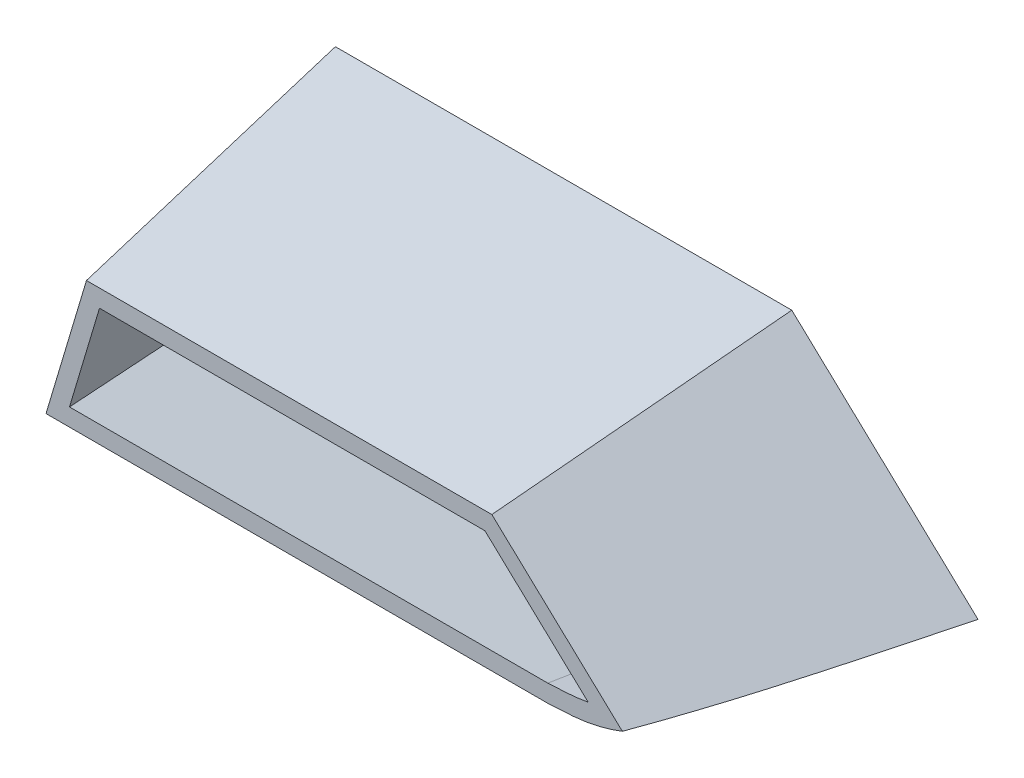
ISO-10303-21;
HEADER;
FILE_DESCRIPTION(('STEP AP214'),'2;1');
FILE_NAME('part.step','',(''),(''),'','','');
FILE_SCHEMA(('AUTOMOTIVE_DESIGN { 1 0 10303 214 1 1 1 1 }'));
ENDSEC;
DATA;
#1=APPLICATION_CONTEXT('core data for automotive mechanical design processes');
#2=APPLICATION_PROTOCOL_DEFINITION('international standard','automotive_design',2000,#1);
#3=PRODUCT_CONTEXT('',#1,'mechanical');
#4=PRODUCT('Part','Part','',(#3));
#5=PRODUCT_RELATED_PRODUCT_CATEGORY('part','',(#4));
#6=PRODUCT_DEFINITION_FORMATION('','',#4);
#7=PRODUCT_DEFINITION_CONTEXT('part definition',#1,'design');
#8=PRODUCT_DEFINITION('design','',#6,#7);
#9=PRODUCT_DEFINITION_SHAPE('','',#8);
#10=(LENGTH_UNIT() NAMED_UNIT(*) SI_UNIT(.MILLI.,.METRE.));
#11=(NAMED_UNIT(*) PLANE_ANGLE_UNIT() SI_UNIT($,.RADIAN.));
#12=(NAMED_UNIT(*) SI_UNIT($,.STERADIAN.) SOLID_ANGLE_UNIT());
#13=UNCERTAINTY_MEASURE_WITH_UNIT(LENGTH_MEASURE(1.E-05),#10,'distance_accuracy_value','');
#14=(GEOMETRIC_REPRESENTATION_CONTEXT(3) GLOBAL_UNCERTAINTY_ASSIGNED_CONTEXT((#13)) GLOBAL_UNIT_ASSIGNED_CONTEXT((#10,
#11,#12)) REPRESENTATION_CONTEXT('',''));
#15=CARTESIAN_POINT('',(0.,0.,0.));
#16=DIRECTION('',(0.,0.,1.));
#17=DIRECTION('',(1.,0.,0.));
#18=AXIS2_PLACEMENT_3D('',#15,#16,#17);
#19=CARTESIAN_POINT('',(14.7936218819312,-5.19866844095488,14.6));
#20=DIRECTION('',(0.,0.,1.));
#21=DIRECTION('',(1.,0.,0.));
#22=AXIS2_PLACEMENT_3D('',#19,#20,#21);
#23=PLANE('',#22);
#24=DIRECTION('',(1.,0.,0.));
#25=VECTOR('',#24,1.);
#26=CARTESIAN_POINT('',(-15.9304061955981,-2.59983174647262,14.6));
#27=LINE('',#26,#25);
#28=CARTESIAN_POINT('',(-14.0583460898602,-2.59983174647262,14.6));
#29=VERTEX_POINT('',#28);
#30=CARTESIAN_POINT('',(10.684004482191,-2.59983174647261,14.6));
#31=VERTEX_POINT('',#30);
#32=EDGE_CURVE('E436',#29,#31,#27,.T.);
#33=ORIENTED_EDGE('',*,*,#32,.F.);
#34=DIRECTION('',(-0.286097759922416,-0.958200434025875,0.));
#35=VECTOR('',#34,1.);
#36=CARTESIAN_POINT('',(-12.0331924026506,4.18282584084831,14.6));
#37=LINE('',#36,#35);
#38=CARTESIAN_POINT('',(-12.5058399284595,2.59983174647262,14.6));
#39=VERTEX_POINT('',#38);
#40=EDGE_CURVE('E456',#39,#29,#37,.T.);
#41=ORIENTED_EDGE('',*,*,#40,.F.);
#42=DIRECTION('',(-1.,0.,0.));
#43=VECTOR('',#42,1.);
#44=CARTESIAN_POINT('',(8.30924752718058,2.59983174647261,14.6));
#45=LINE('',#44,#43);
#46=CARTESIAN_POINT('',(7.43198936747582,2.59983174647261,14.6));
#47=VERTEX_POINT('',#46);
#48=EDGE_CURVE('E467',#47,#39,#45,.T.);
#49=ORIENTED_EDGE('',*,*,#48,.F.);
#50=DIRECTION('',(-0.729323810427005,0.68416867769888,0.));
#51=VECTOR('',#50,1.);
#52=CARTESIAN_POINT('',(15.2546473535326,-4.73849657065382,14.6));
#53=LINE('',#52,#51);
#54=CARTESIAN_POINT('',(12.7716860804026,-2.40926460711722,14.6));
#55=VERTEX_POINT('',#54);
#56=EDGE_CURVE('E463',#55,#47,#53,.T.);
#57=ORIENTED_EDGE('',*,*,#56,.F.);
#58=CARTESIAN_POINT('',(10.684004482191,-2.59983174647261,14.6));
#59=CARTESIAN_POINT('',(10.7714044682376,-2.59588328886062,14.6));
#60=CARTESIAN_POINT('',(10.8588056438328,-2.59193488725516,14.6));
#61=CARTESIAN_POINT('',(11.0335344538954,-2.58370416022969,14.6));
#62=CARTESIAN_POINT('',(11.1208620989292,-2.57942205609473,14.6));
#63=CARTESIAN_POINT('',(11.295426720252,-2.5701885531721,14.6));
#64=CARTESIAN_POINT('',(11.3826637187209,-2.5652375869616,14.6));
#65=CARTESIAN_POINT('',(11.5570267319296,-2.5542863804719,14.6));
#66=CARTESIAN_POINT('',(11.6441527810351,-2.54828670053682,14.6));
#67=CARTESIAN_POINT('',(11.8183567259758,-2.53483111086446,14.6));
#68=CARTESIAN_POINT('',(11.905434543931,-2.52737417215942,14.6));
#69=CARTESIAN_POINT('',(12.0794060434387,-2.51053228288508,14.6));
#70=CARTESIAN_POINT('',(12.1662997291294,-2.50114737611906,14.6));
#71=CARTESIAN_POINT('',(12.3398203779396,-2.47976959008637,14.6));
#72=CARTESIAN_POINT('',(12.426447170661,-2.46777529783742,14.6));
#73=CARTESIAN_POINT('',(12.599379843234,-2.4408260426048,14.6));
#74=CARTESIAN_POINT('',(12.6856849818115,-2.42586634374298,14.6));
#75=CARTESIAN_POINT('',(12.7716860804026,-2.40926460711722,14.6));
#76=B_SPLINE_CURVE_WITH_KNOTS('',3,(#58,#59,#60,#61,#62,#63,#64,#65,#66,#67,#68,#69,#70,#71,#72,
#73,#74,#75),.UNSPECIFIED.,.F.,.F.,(4,2,2,2,2,2,2,2,4),(0.,0.262469383072965,0.52476617454889,
0.786894134166097,1.0488824604843,1.31105644907393,1.57322448175061,1.83553483335355,
2.09826753053661),.UNSPECIFIED.);
#77=EDGE_CURVE('E460',#31,#55,#76,.T.);
#78=ORIENTED_EDGE('',*,*,#77,.F.);
#79=EDGE_LOOP('',(#33,#41,#49,#57,#78));
#80=FACE_BOUND('',#79,.T.);
#81=DIRECTION('',(1.,0.,0.));
#82=VECTOR('',#81,1.);
#83=CARTESIAN_POINT('',(14.7936218819312,3.50480108227789,14.6));
#84=LINE('',#83,#82);
#85=CARTESIAN_POINT('',(7.79002044881684,3.50480108227789,14.6));
#86=VERTEX_POINT('',#85);
#87=CARTESIAN_POINT('',(-13.1800826162012,3.50480108227789,14.6));
#88=VERTEX_POINT('',#87);
#89=EDGE_CURVE('E320',#86,#88,#84,.F.);
#90=ORIENTED_EDGE('',*,*,#89,.T.);
#91=DIRECTION('',(0.286097759922416,0.958200434025875,0.));
#92=VECTOR('',#91,1.);
#93=CARTESIAN_POINT('',(-13.276341375105,3.18241063579048,14.6));
#94=LINE('',#93,#92);
#95=CARTESIAN_POINT('',(-15.2729970065662,-3.5048010822779,14.6));
#96=VERTEX_POINT('',#95);
#97=EDGE_CURVE('E12',#88,#96,#94,.F.);
#98=ORIENTED_EDGE('',*,*,#97,.T.);
#99=DIRECTION('',(-1.,0.,0.));
#100=VECTOR('',#99,1.);
#101=CARTESIAN_POINT('',(14.7936218819312,-3.50480108227789,14.6));
#102=LINE('',#101,#100);
#103=CARTESIAN_POINT('',(10.7043290764765,-3.50480108227789,14.6));
#104=VERTEX_POINT('',#103);
#105=EDGE_CURVE('E214',#96,#104,#102,.F.);
#106=ORIENTED_EDGE('',*,*,#105,.T.);
#107=CARTESIAN_POINT('',(10.6524149917925,-3.50713874079241,14.6));
#108=CARTESIAN_POINT('',(10.772277045654,-3.50170925551978,14.6));
#109=CARTESIAN_POINT('',(10.8921458689353,-3.49633428803626,14.6));
#110=CARTESIAN_POINT('',(11.1321015272363,-3.48489312213885,14.6));
#111=CARTESIAN_POINT('',(11.2521882927576,-3.47882549889116,14.6));
#112=CARTESIAN_POINT('',(11.4923755007352,-3.46520956486976,14.6));
#113=CARTESIAN_POINT('',(11.612475880399,-3.45766009946973,14.6));
#114=CARTESIAN_POINT('',(11.8531336364871,-3.4400980031663,14.6));
#115=CARTESIAN_POINT('',(11.973690142518,-3.43007277016102,14.6));
#116=CARTESIAN_POINT('',(12.154225360788,-3.41241590825715,14.6));
#117=CARTESIAN_POINT('',(12.2143323374642,-3.40609652126912,14.6));
#118=CARTESIAN_POINT('',(12.3344310160354,-3.39244387218179,14.6));
#119=CARTESIAN_POINT('',(12.3944227200504,-3.38511062891366,14.6));
#120=CARTESIAN_POINT('',(12.5142187158919,-3.36924116668151,14.6));
#121=CARTESIAN_POINT('',(12.5740230842826,-3.36070553083567,14.6));
#122=CARTESIAN_POINT('',(12.6934284040449,-3.34230794545135,14.6));
#123=CARTESIAN_POINT('',(12.7530293510446,-3.33244596758969,14.6));
#124=CARTESIAN_POINT('',(12.8932911568202,-3.30769479525054,14.6));
#125=CARTESIAN_POINT('',(12.9738580779211,-3.29226930835966,14.6));
#126=CARTESIAN_POINT('',(13.1345136960284,-3.25910931364986,14.6));
#127=CARTESIAN_POINT('',(13.214602377847,-3.24137473290294,14.6));
#128=CARTESIAN_POINT('',(13.4542466415532,-3.18476461184645,14.6));
#129=CARTESIAN_POINT('',(13.6130221520276,-3.14251080671862,14.6));
#130=CARTESIAN_POINT('',(13.8493289918649,-3.07268262547496,14.6));
#131=CARTESIAN_POINT('',(13.9278294433236,-3.04831743263716,14.6));
#132=CARTESIAN_POINT('',(14.0841659147625,-2.99753555830933,14.6));
#133=CARTESIAN_POINT('',(14.1620019253518,-2.9711188478776,14.6));
#134=CARTESIAN_POINT('',(14.394036605793,-2.88887732870711,14.6));
#135=CARTESIAN_POINT('',(14.5471497774846,-2.82994665603595,14.6));
#136=CARTESIAN_POINT('',(14.8494334065726,-2.70305994031673,14.6));
#137=CARTESIAN_POINT('',(14.9986079039164,-2.63511361313214,14.6));
#138=CARTESIAN_POINT('',(15.2185297675916,-2.52573431927287,14.6));
#139=CARTESIAN_POINT('',(15.2911547572951,-2.48805603049151,14.6));
#140=CARTESIAN_POINT('',(15.3990385327609,-2.42960174849371,14.6));
#141=CARTESIAN_POINT('',(15.4348232782175,-2.40979470697124,14.6));
#142=CARTESIAN_POINT('',(15.5060057071773,-2.36949694606007,14.6));
#143=CARTESIAN_POINT('',(15.5414033915777,-2.34900622825642,14.6));
#144=CARTESIAN_POINT('',(15.6566138683972,-2.28088191443597,14.6));
#145=CARTESIAN_POINT('',(15.7356249777476,-2.23188981630183,14.6));
#146=CARTESIAN_POINT('',(15.8920808016518,-2.13138288903183,14.6));
#147=CARTESIAN_POINT('',(15.9695244833564,-2.07986646837561,14.6));
#148=CARTESIAN_POINT('',(16.1232101831306,-1.97497120860202,14.6));
#149=CARTESIAN_POINT('',(16.1994513738978,-1.92159116208243,14.6));
#150=CARTESIAN_POINT('',(16.3511352161696,-1.81344210567241,14.6));
#151=CARTESIAN_POINT('',(16.4265762693957,-1.75867086554931,14.6));
#152=CARTESIAN_POINT('',(16.5768348028442,-1.64840435113619,14.6));
#153=CARTESIAN_POINT('',(16.6516527206602,-1.59290967028914,14.6));
#154=CARTESIAN_POINT('',(16.8008481739743,-1.48162781561766,14.6));
#155=CARTESIAN_POINT('',(16.8752262786624,-1.42584140619133,14.6));
#156=CARTESIAN_POINT('',(16.949589159885,-1.37003825472121,14.6));
#157=B_SPLINE_CURVE_WITH_KNOTS('',3,(#107,#108,#109,#110,#111,#112,#113,#114,#115,#116,#117,
#118,#119,#120,#121,#122,#123,#124,#125,#126,#127,#128,#129,#130,#131,#132,#133,#134,#135,#136,
#137,#138,#139,#140,#141,#142,#143,#144,#145,#146,#147,#148,#149,#150,#151,#152,#153,#154,#155,
#156),.UNSPECIFIED.,.F.,.F.,(4,2,2,2,2,2,2,2,2,2,2,2,2,2,2,2,2,2,2,2,2,2,2,2,4),(0.,
0.35996237248499,0.72067902540766,1.08167786643008,1.44455356517412,1.62586139556981,
1.80716585884167,1.98838269659848,2.1696034047403,2.41565657840056,2.6617175250326,
3.15432105844578,3.40088302730469,3.64744847515816,4.13936772785254,4.63076109742553,
4.87616422323666,4.99885955825825,5.12155460883993,5.400384447239,5.67939240120656,
5.95858460096019,6.23825681099338,6.51771247577042,6.79663256107343),.UNSPECIFIED.);
#158=CARTESIAN_POINT('',(14.54283062352,-2.82991765571762,14.6000000000001));
#159=VERTEX_POINT('',#158);
#160=EDGE_CURVE('E370',#104,#159,#157,.T.);
#161=ORIENTED_EDGE('',*,*,#160,.T.);
#162=DIRECTION('',(0.729323810427005,-0.68416867769888,0.));
#163=VECTOR('',#162,1.);
#164=CARTESIAN_POINT('',(15.8581902772041,-4.0638385315939,14.6));
#165=LINE('',#164,#163);
#166=EDGE_CURVE('E367',#159,#86,#165,.F.);
#167=ORIENTED_EDGE('',*,*,#166,.T.);
#168=EDGE_LOOP('',(#90,#98,#106,#161,#167));
#169=FACE_BOUND('',#168,.T.);
#170=ADVANCED_FACE('F205',(#80,#169),#23,.T.);
#171=CARTESIAN_POINT('',(14.7844506684725,-5.20120377943338,0.));
#172=DIRECTION('',(0.,0.,1.));
#173=DIRECTION('',(1.,0.,0.));
#174=AXIS2_PLACEMENT_3D('',#171,#172,#173);
#175=PLANE('',#174);
#176=DIRECTION('',(-1.,0.,0.));
#177=VECTOR('',#176,1.);
#178=CARTESIAN_POINT('',(8.70487538679465,5.81721391101612,0.));
#179=LINE('',#178,#177);
#180=CARTESIAN_POINT('',(8.70487538679465,5.81721391101612,0.));
#181=VERTEX_POINT('',#180);
#182=CARTESIAN_POINT('',(-14.9029337440017,5.81721391101613,0.));
#183=VERTEX_POINT('',#182);
#184=EDGE_CURVE('E317',#181,#183,#179,.T.);
#185=ORIENTED_EDGE('',*,*,#184,.F.);
#186=DIRECTION('',(-0.729323810427005,0.68416867769888,0.));
#187=VECTOR('',#186,1.);
#188=CARTESIAN_POINT('',(18.3378563604631,-3.21935360649656,0.));
#189=LINE('',#188,#187);
#190=CARTESIAN_POINT('',(18.3378563604631,-3.21935360649656,0.));
#191=VERTEX_POINT('',#190);
#192=EDGE_CURVE('E328',#191,#181,#189,.T.);
#193=ORIENTED_EDGE('',*,*,#192,.F.);
#194=CARTESIAN_POINT('',(10.7563659342078,-5.81721391101612,0.));
#195=CARTESIAN_POINT('',(11.4399998810973,-5.78645110556188,0.));
#196=CARTESIAN_POINT('',(12.1236694648124,-5.75613160349603,0.));
#197=CARTESIAN_POINT('',(13.4810072981065,-5.57108125666555,0.));
#198=CARTESIAN_POINT('',(14.143159604675,-5.41365512562631,0.));
#199=CARTESIAN_POINT('',(15.1050962003712,-5.09497810633691,0.));
#200=CARTESIAN_POINT('',(15.4211702976325,-4.97510237980859,0.));
#201=CARTESIAN_POINT('',(16.0426625545695,-4.70353288078844,0.));
#202=CARTESIAN_POINT('',(16.3491061258154,-4.55123457448258,0.));
#203=CARTESIAN_POINT('',(17.2419644695506,-4.04008588116488,0.));
#204=CARTESIAN_POINT('',(17.7903481375785,-3.63036393372277,0.));
#205=CARTESIAN_POINT('',(18.3378563604631,-3.21935360649656,0.));
#206=B_SPLINE_CURVE_WITH_KNOTS('',3,(#194,#195,#196,#197,#198,#199,#200,#201,#202,#203,#204,
#205),.UNSPECIFIED.,.F.,.F.,(4,2,2,2,2,4),(0.,0.25,0.5,0.625,0.75,1.),.UNSPECIFIED.);
#207=CARTESIAN_POINT('',(10.7563659342078,-5.81721391101612,0.));
#208=VERTEX_POINT('',#207);
#209=EDGE_CURVE('E334',#208,#191,#206,.T.);
#210=ORIENTED_EDGE('',*,*,#209,.F.);
#211=DIRECTION('',(1.,0.,0.));
#212=VECTOR('',#211,1.);
#213=CARTESIAN_POINT('',(10.1422704682804,-5.81721391101613,0.));
#214=LINE('',#213,#212);
#215=CARTESIAN_POINT('',(-15.9577295317196,-5.81721391101613,0.));
#216=VERTEX_POINT('',#215);
#217=EDGE_CURVE('E354',#216,#208,#214,.T.);
#218=ORIENTED_EDGE('',*,*,#217,.F.);
#219=DIRECTION('',(0.99850798449248,-0.0546059054019312,0.));
#220=VECTOR('',#219,1.);
#221=CARTESIAN_POINT('',(-18.3378563604631,-5.68705072506922,0.));
#222=LINE('',#221,#220);
#223=CARTESIAN_POINT('',(-18.3378563604631,-5.68705072506922,0.));
#224=VERTEX_POINT('',#223);
#225=EDGE_CURVE('E345',#224,#216,#222,.T.);
#226=ORIENTED_EDGE('',*,*,#225,.F.);
#227=DIRECTION('',(-0.286097759922416,-0.958200434025875,0.));
#228=VECTOR('',#227,1.);
#229=CARTESIAN_POINT('',(-14.9029337440017,5.81721391101613,0.));
#230=LINE('',#229,#228);
#231=EDGE_CURVE('E339',#183,#224,#230,.T.);
#232=ORIENTED_EDGE('',*,*,#231,.F.);
#233=EDGE_LOOP('',(#185,#193,#210,#218,#226,#232));
#234=FACE_BOUND('',#233,.T.);
#235=DIRECTION('',(-1.,0.,0.));
#236=VECTOR('',#235,1.);
#237=CARTESIAN_POINT('',(8.70487538679465,4.81721391101612,0.));
#238=LINE('',#237,#236);
#239=CARTESIAN_POINT('',(8.30924752718058,4.81721391101612,0.));
#240=VERTEX_POINT('',#239);
#241=CARTESIAN_POINT('',(-14.1578889551174,4.81721391101613,0.));
#242=VERTEX_POINT('',#241);
#243=EDGE_CURVE('E229',#240,#242,#238,.T.);
#244=ORIENTED_EDGE('',*,*,#243,.T.);
#245=DIRECTION('',(-0.286097759922416,-0.958200434025875,0.));
#246=VECTOR('',#245,1.);
#247=CARTESIAN_POINT('',(-13.9447333099758,5.53111615109371,0.));
#248=LINE('',#247,#246);
#249=CARTESIAN_POINT('',(-17.0167802101693,-4.75780283209426,0.));
#250=VERTEX_POINT('',#249);
#251=EDGE_CURVE('E497',#242,#250,#248,.T.);
#252=ORIENTED_EDGE('',*,*,#251,.T.);
#253=DIRECTION('',(0.99850798449248,-0.0546059054019312,0.));
#254=VECTOR('',#253,1.);
#255=CARTESIAN_POINT('',(-18.2832504550612,-4.68854274057674,0.));
#256=LINE('',#255,#254);
#257=CARTESIAN_POINT('',(-15.9304061955981,-4.81721391101613,0.));
#258=VERTEX_POINT('',#257);
#259=EDGE_CURVE('E501',#250,#258,#256,.T.);
#260=ORIENTED_EDGE('',*,*,#259,.T.);
#261=DIRECTION('',(1.,0.,0.));
#262=VECTOR('',#261,1.);
#263=CARTESIAN_POINT('',(10.1422704682804,-4.81721391101613,0.));
#264=LINE('',#263,#262);
#265=CARTESIAN_POINT('',(10.7338795631964,-4.81721391101612,0.));
#266=VERTEX_POINT('',#265);
#267=EDGE_CURVE('E505',#258,#266,#264,.T.);
#268=ORIENTED_EDGE('',*,*,#267,.T.);
#269=CARTESIAN_POINT('',(10.7338795631964,-4.81721391101612,0.));
#270=CARTESIAN_POINT('',(11.2656664285154,-4.79328577748789,0.));
#271=CARTESIAN_POINT('',(11.7974914211823,-4.76979870441315,0.));
#272=CARTESIAN_POINT('',(12.5910169859251,-4.68584419111581,0.));
#273=CARTESIAN_POINT('',(12.8553967136918,-4.64890756717737,0.));
#274=CARTESIAN_POINT('',(13.3792342766133,-4.5521716736048,0.));
#275=CARTESIAN_POINT('',(13.6374597378343,-4.49344114392596,0.));
#276=CARTESIAN_POINT('',(14.4018465509392,-4.28837945402763,0.));
#277=CARTESIAN_POINT('',(14.8985010811795,-4.11537440123164,0.));
#278=CARTESIAN_POINT('',(15.6215705928788,-3.79438613770425,0.));
#279=CARTESIAN_POINT('',(15.8587812454868,-3.67669302636813,0.));
#280=CARTESIAN_POINT('',(16.3240439728678,-3.41561000086542,0.));
#281=CARTESIAN_POINT('',(16.5505059753723,-3.27184794804296,0.));
#282=CARTESIAN_POINT('',(16.7717107770014,-3.12130696123607,0.));
#283=B_SPLINE_CURVE_WITH_KNOTS('',3,(#269,#270,#271,#272,#273,#274,#275,#276,#277,#278,#279,
#280,#281,#282),.UNSPECIFIED.,.F.,.F.,(4,2,2,2,2,2,4),(0.,0.25,0.374999999999999,
0.499999999999999,0.75,0.875,1.),.UNSPECIFIED.);
#284=CARTESIAN_POINT('',(16.7717107770014,-3.12130696123606,0.));
#285=VERTEX_POINT('',#284);
#286=EDGE_CURVE('E509',#266,#285,#283,.T.);
#287=ORIENTED_EDGE('',*,*,#286,.T.);
#288=DIRECTION('',(-0.729323810427005,0.68416867769888,0.));
#289=VECTOR('',#288,1.);
#290=CARTESIAN_POINT('',(17.6536876827643,-3.94867741692356,0.));
#291=LINE('',#290,#289);
#292=EDGE_CURVE('E513',#285,#240,#291,.T.);
#293=ORIENTED_EDGE('',*,*,#292,.T.);
#294=EDGE_LOOP('',(#244,#252,#260,#268,#287,#293));
#295=FACE_BOUND('',#294,.T.);
#296=ADVANCED_FACE('F207',(#234,#295),#175,.F.);
#297=CARTESIAN_POINT('',(8.70487538679465,4.81721391101612,0.6));
#298=DIRECTION('',(0.,-1.,0.));
#299=DIRECTION('',(1.,0.,0.));
#300=AXIS2_PLACEMENT_3D('',#297,#298,#299);
#301=PLANE('',#300);
#302=ORIENTED_EDGE('',*,*,#243,.F.);
#303=DIRECTION('',(0.,0.,-1.));
#304=VECTOR('',#303,1.);
#305=CARTESIAN_POINT('',(8.30924752718058,4.81721391101612,0.6));
#306=LINE('',#305,#304);
#307=CARTESIAN_POINT('',(8.30924752718058,4.81721391101612,0.6));
#308=VERTEX_POINT('',#307);
#309=EDGE_CURVE('E541',#308,#240,#306,.T.);
#310=ORIENTED_EDGE('',*,*,#309,.F.);
#311=DIRECTION('',(-1.,0.,0.));
#312=VECTOR('',#311,1.);
#313=CARTESIAN_POINT('',(8.70487538679465,4.81721391101612,0.6));
#314=LINE('',#313,#312);
#315=CARTESIAN_POINT('',(-14.1578889551174,4.81721391101613,0.6));
#316=VERTEX_POINT('',#315);
#317=EDGE_CURVE('E517',#308,#316,#314,.T.);
#318=ORIENTED_EDGE('',*,*,#317,.T.);
#319=DIRECTION('',(0.,0.,-1.));
#320=VECTOR('',#319,1.);
#321=CARTESIAN_POINT('',(-14.1578889551174,4.81721391101613,0.6));
#322=LINE('',#321,#320);
#323=EDGE_CURVE('E341',#316,#242,#322,.T.);
#324=ORIENTED_EDGE('',*,*,#323,.T.);
#325=EDGE_LOOP('',(#302,#310,#318,#324));
#326=FACE_BOUND('',#325,.T.);
#327=ADVANCED_FACE('F432',(#326),#301,.T.);
#328=CARTESIAN_POINT('',(-13.9447333099758,5.53111615109371,0.6));
#329=DIRECTION('',(0.958200434025875,-0.286097759922416,0.));
#330=DIRECTION('',(0.286097759922416,0.958200434025875,0.));
#331=AXIS2_PLACEMENT_3D('',#328,#329,#330);
#332=PLANE('',#331);
#333=ORIENTED_EDGE('',*,*,#251,.F.);
#334=ORIENTED_EDGE('',*,*,#323,.F.);
#335=DIRECTION('',(-0.286097759922416,-0.958200434025875,0.));
#336=VECTOR('',#335,1.);
#337=CARTESIAN_POINT('',(-13.9447333099758,5.53111615109371,0.6));
#338=LINE('',#337,#336);
#339=CARTESIAN_POINT('',(-17.0167802101693,-4.75780283209426,0.6));
#340=VERTEX_POINT('',#339);
#341=EDGE_CURVE('E521',#316,#340,#338,.T.);
#342=ORIENTED_EDGE('',*,*,#341,.T.);
#343=DIRECTION('',(0.,0.,-1.));
#344=VECTOR('',#343,1.);
#345=CARTESIAN_POINT('',(-17.0167802101693,-4.75780283209426,0.6));
#346=LINE('',#345,#344);
#347=EDGE_CURVE('E347',#340,#250,#346,.T.);
#348=ORIENTED_EDGE('',*,*,#347,.T.);
#349=EDGE_LOOP('',(#333,#334,#342,#348));
#350=FACE_BOUND('',#349,.T.);
#351=ADVANCED_FACE('F584',(#350),#332,.T.);
#352=CARTESIAN_POINT('',(-18.2832504550612,-4.68854274057674,0.6));
#353=DIRECTION('',(0.0546059054019312,0.99850798449248,0.));
#354=DIRECTION('',(-0.99850798449248,0.0546059054019312,0.));
#355=AXIS2_PLACEMENT_3D('',#352,#353,#354);
#356=PLANE('',#355);
#357=ORIENTED_EDGE('',*,*,#259,.F.);
#358=ORIENTED_EDGE('',*,*,#347,.F.);
#359=DIRECTION('',(0.99850798449248,-0.0546059054019312,0.));
#360=VECTOR('',#359,1.);
#361=CARTESIAN_POINT('',(-18.2832504550612,-4.68854274057674,0.6));
#362=LINE('',#361,#360);
#363=CARTESIAN_POINT('',(-15.9304061955981,-4.81721391101613,0.6));
#364=VERTEX_POINT('',#363);
#365=EDGE_CURVE('E525',#340,#364,#362,.T.);
#366=ORIENTED_EDGE('',*,*,#365,.T.);
#367=DIRECTION('',(0.,0.,-1.));
#368=VECTOR('',#367,1.);
#369=CARTESIAN_POINT('',(-15.9304061955981,-4.81721391101613,0.6));
#370=LINE('',#369,#368);
#371=EDGE_CURVE('E550',#364,#258,#370,.T.);
#372=ORIENTED_EDGE('',*,*,#371,.T.);
#373=EDGE_LOOP('',(#357,#358,#366,#372));
#374=FACE_BOUND('',#373,.T.);
#375=ADVANCED_FACE('F580',(#374),#356,.T.);
#376=CARTESIAN_POINT('',(10.1422704682804,-4.81721391101613,0.6));
#377=DIRECTION('',(0.,1.,0.));
#378=DIRECTION('',(-1.,0.,0.));
#379=AXIS2_PLACEMENT_3D('',#376,#377,#378);
#380=PLANE('',#379);
#381=ORIENTED_EDGE('',*,*,#267,.F.);
#382=ORIENTED_EDGE('',*,*,#371,.F.);
#383=DIRECTION('',(1.,0.,0.));
#384=VECTOR('',#383,1.);
#385=CARTESIAN_POINT('',(-15.9577295317196,-4.81721391101613,0.6));
#386=LINE('',#385,#384);
#387=CARTESIAN_POINT('',(10.7338795631964,-4.81721391101612,0.6));
#388=VERTEX_POINT('',#387);
#389=EDGE_CURVE('E529',#364,#388,#386,.T.);
#390=ORIENTED_EDGE('',*,*,#389,.T.);
#391=DIRECTION('',(0.,0.,-1.));
#392=VECTOR('',#391,1.);
#393=CARTESIAN_POINT('',(10.7338795631964,-4.81721391101612,0.6));
#394=LINE('',#393,#392);
#395=EDGE_CURVE('E547',#388,#266,#394,.T.);
#396=ORIENTED_EDGE('',*,*,#395,.T.);
#397=EDGE_LOOP('',(#381,#382,#390,#396));
#398=FACE_BOUND('',#397,.T.);
#399=ADVANCED_FACE('F575',(#398),#380,.T.);
#400=CARTESIAN_POINT('',(10.7338795631964,-4.81721391101612,0.6));
#401=CARTESIAN_POINT('',(11.2656664285154,-4.79328577748789,0.6));
#402=CARTESIAN_POINT('',(11.7974914211823,-4.76979870441315,0.6));
#403=CARTESIAN_POINT('',(12.5910169859251,-4.68584419111581,0.6));
#404=CARTESIAN_POINT('',(12.8553967136918,-4.64890756717737,0.6));
#405=CARTESIAN_POINT('',(13.3792342766133,-4.5521716736048,0.6));
#406=CARTESIAN_POINT('',(13.6374597378343,-4.49344114392596,0.6));
#407=CARTESIAN_POINT('',(14.4018465509392,-4.28837945402763,0.6));
#408=CARTESIAN_POINT('',(14.8985010811795,-4.11537440123164,0.6));
#409=CARTESIAN_POINT('',(15.6215705928788,-3.79438613770425,0.6));
#410=CARTESIAN_POINT('',(15.8587812454868,-3.67669302636813,0.6));
#411=CARTESIAN_POINT('',(16.3240439728678,-3.41561000086542,0.6));
#412=CARTESIAN_POINT('',(16.5505059753723,-3.27184794804296,0.6));
#413=CARTESIAN_POINT('',(16.7717107770014,-3.12130696123607,0.6));
#414=B_SPLINE_CURVE_WITH_KNOTS('',3,(#400,#401,#402,#403,#404,#405,#406,#407,#408,#409,#410,
#411,#412,#413),.UNSPECIFIED.,.F.,.F.,(4,2,2,2,2,2,4),(0.,0.25,0.374999999999999,
0.499999999999999,0.75,0.875,1.),.UNSPECIFIED.);
#415=DIRECTION('',(0.,0.,-1.));
#416=VECTOR('',#415,1.);
#417=SURFACE_OF_LINEAR_EXTRUSION('',#414,#416);
#418=ORIENTED_EDGE('',*,*,#286,.F.);
#419=ORIENTED_EDGE('',*,*,#395,.F.);
#420=CARTESIAN_POINT('',(16.7717107770014,-3.12130696123607,0.6));
#421=VERTEX_POINT('',#420);
#422=EDGE_CURVE('E533',#388,#421,#414,.T.);
#423=ORIENTED_EDGE('',*,*,#422,.T.);
#424=DIRECTION('',(0.,0.,-1.));
#425=VECTOR('',#424,1.);
#426=CARTESIAN_POINT('',(16.7717107770014,-3.12130696123606,0.6));
#427=LINE('',#426,#425);
#428=EDGE_CURVE('E544',#421,#285,#427,.T.);
#429=ORIENTED_EDGE('',*,*,#428,.T.);
#430=EDGE_LOOP('',(#418,#419,#423,#429));
#431=FACE_BOUND('',#430,.T.);
#432=ADVANCED_FACE('F570',(#431),#417,.T.);
#433=CARTESIAN_POINT('',(17.6536876827643,-3.94867741692356,0.6));
#434=DIRECTION('',(-0.68416867769888,-0.729323810427005,0.));
#435=DIRECTION('',(0.729323810427005,-0.68416867769888,0.));
#436=AXIS2_PLACEMENT_3D('',#433,#434,#435);
#437=PLANE('',#436);
#438=ORIENTED_EDGE('',*,*,#292,.F.);
#439=ORIENTED_EDGE('',*,*,#428,.F.);
#440=DIRECTION('',(-0.729323810427005,0.68416867769888,0.));
#441=VECTOR('',#440,1.);
#442=CARTESIAN_POINT('',(17.6536876827643,-3.94867741692356,0.6));
#443=LINE('',#442,#441);
#444=EDGE_CURVE('E537',#421,#308,#443,.T.);
#445=ORIENTED_EDGE('',*,*,#444,.T.);
#446=ORIENTED_EDGE('',*,*,#309,.T.);
#447=EDGE_LOOP('',(#438,#439,#445,#446));
#448=FACE_BOUND('',#447,.T.);
#449=ADVANCED_FACE('F574',(#448),#437,.T.);
#450=CARTESIAN_POINT('',(-14.1578889551174,4.81721391101613,0.6));
#451=DIRECTION('',(0.946403396640558,-0.282575421745757,-0.156434465040231));
#452=DIRECTION('',(0.286097759922416,0.958200434025875,0.));
#453=AXIS2_PLACEMENT_3D('',#450,#451,#452);
#454=PLANE('',#453);
#455=ORIENTED_EDGE('',*,*,#40,.T.);
#456=DIRECTION('',(-0.205485856940811,-0.153096166903161,-0.966611155675776));
#457=VECTOR('',#456,1.);
#458=CARTESIAN_POINT('',(-16.9878985184575,-4.78247951716218,0.819304331806671));
#459=LINE('',#458,#457);
#460=CARTESIAN_POINT('',(-15.9074625837823,-3.97750635430921,5.90170485804238));
#461=VERTEX_POINT('',#460);
#462=EDGE_CURVE('E492',#29,#461,#459,.T.);
#463=ORIENTED_EDGE('',*,*,#462,.T.);
#464=DIRECTION('',(-0.20271013511482,-0.142586758453115,-0.9688021559821));
#465=VECTOR('',#464,1.);
#466=CARTESIAN_POINT('',(-17.0167802101693,-4.75780283209426,0.6));
#467=LINE('',#466,#465);
#468=EDGE_CURVE('E488',#461,#340,#467,.T.);
#469=ORIENTED_EDGE('',*,*,#468,.T.);
#470=ORIENTED_EDGE('',*,*,#341,.F.);
#471=DIRECTION('',(-0.115767041939924,0.155382661105913,-0.981047511911694));
#472=VECTOR('',#471,1.);
#473=CARTESIAN_POINT('',(-14.1578889551174,4.81721391101613,0.6));
#474=LINE('',#473,#472);
#475=EDGE_CURVE('E471',#39,#316,#474,.T.);
#476=ORIENTED_EDGE('',*,*,#475,.F.);
#477=EDGE_LOOP('',(#455,#463,#469,#470,#476));
#478=FACE_BOUND('',#477,.T.);
#479=ADVANCED_FACE('F614',(#478),#454,.T.);
#480=CARTESIAN_POINT('',(-15.9304061955981,-4.81721391101613,0.6));
#481=DIRECTION('',(0.,0.987688340595138,-0.156434465040231));
#482=DIRECTION('',(0.,0.156434465040231,0.987688340595138));
#483=AXIS2_PLACEMENT_3D('',#480,#481,#482);
#484=PLANE('',#483);
#485=ORIENTED_EDGE('',*,*,#462,.F.);
#486=ORIENTED_EDGE('',*,*,#32,.T.);
#487=CARTESIAN_POINT('',(10.684004482191,-2.59983174647261,14.6));
#488=CARTESIAN_POINT('',(10.6899478892367,-2.86377867722349,12.9335046661778));
#489=CARTESIAN_POINT('',(10.6958872654095,-3.12772561019361,11.2670093183439));
#490=CARTESIAN_POINT('',(10.707168750404,-3.62926277116385,8.10042830860226));
#491=CARTESIAN_POINT('',(10.7125112770737,-3.86685299893393,6.60034264814694));
#492=CARTESIAN_POINT('',(10.7231954291855,-4.34203345497019,3.60017132410407));
#493=CARTESIAN_POINT('',(10.7285370546276,-4.57962368323636,2.10008566051653));
#494=CARTESIAN_POINT('',(10.7338795631964,-4.81721391101612,0.6));
#495=B_SPLINE_CURVE_WITH_KNOTS('',3,(#487,#488,#489,#490,#491,#492,#493,#494),.UNSPECIFIED.,.F.,
.F.,(4,2,2,4),(0.,5.06183662672969,9.61821806693169,14.1745995071369),.UNSPECIFIED.);
#496=EDGE_CURVE('E482',#31,#388,#495,.T.);
#497=ORIENTED_EDGE('',*,*,#496,.T.);
#498=ORIENTED_EDGE('',*,*,#389,.F.);
#499=DIRECTION('',(-0.00427427242455131,-0.156433036051424,-0.987679318314895));
#500=VECTOR('',#499,1.);
#501=CARTESIAN_POINT('',(-15.9304061955981,-4.81721391101613,0.6));
#502=LINE('',#501,#500);
#503=EDGE_CURVE('E485',#461,#364,#502,.T.);
#504=ORIENTED_EDGE('',*,*,#503,.F.);
#505=EDGE_LOOP('',(#485,#486,#497,#498,#504));
#506=FACE_BOUND('',#505,.T.);
#507=ADVANCED_FACE('F621',(#506),#484,.T.);
#508=CARTESIAN_POINT('',(-17.0167802101693,-4.75780283209426,0.6));
#509=DIRECTION('',(0.053933616093129,0.986214694274373,-0.156434465040231));
#510=DIRECTION('',(0.,0.156662483631572,0.987652199016631));
#511=AXIS2_PLACEMENT_3D('',#508,#509,#510);
#512=PLANE('',#511);
#513=ORIENTED_EDGE('',*,*,#365,.F.);
#514=ORIENTED_EDGE('',*,*,#468,.F.);
#515=ORIENTED_EDGE('',*,*,#503,.T.);
#516=EDGE_LOOP('',(#513,#514,#515));
#517=FACE_BOUND('',#516,.T.);
#518=ADVANCED_FACE('F629',(#517),#512,.T.);
#519=CARTESIAN_POINT('',(10.6142733286619,-2.15904483733104,17.4));
#520=CARTESIAN_POINT('',(10.8809020254569,-2.14704769118123,17.4));
#521=CARTESIAN_POINT('',(11.1338020132425,-2.13567224001513,17.4));
#522=CARTESIAN_POINT('',(11.4920130506735,-2.11427994732288,17.4));
#523=CARTESIAN_POINT('',(11.6078932028685,-2.10644781258683,17.4));
#524=CARTESIAN_POINT('',(11.7763854014995,-2.09316969097126,17.4));
#525=CARTESIAN_POINT('',(11.8316618098857,-2.08848990796535,17.4));
#526=CARTESIAN_POINT('',(11.9404385225992,-2.07855773726435,17.4));
#527=CARTESIAN_POINT('',(11.9945730937444,-2.07323832731769,17.4));
#528=CARTESIAN_POINT('',(12.0985344067405,-2.0622391463431,17.4));
#529=CARTESIAN_POINT('',(12.1487086347459,-2.05649548139037,17.4));
#530=CARTESIAN_POINT('',(12.2491683107006,-2.04409826925276,17.4));
#531=CARTESIAN_POINT('',(12.2988176328361,-2.03751207737019,17.4));
#532=CARTESIAN_POINT('',(12.3968639148885,-2.02355331224106,17.4));
#533=CARTESIAN_POINT('',(12.4452608325341,-2.01618073002911,17.4));
#534=CARTESIAN_POINT('',(12.5407132645679,-2.00064459897892,17.4));
#535=CARTESIAN_POINT('',(12.5870900027781,-1.99260632697421,17.4));
#536=CARTESIAN_POINT('',(12.681131739425,-1.97523996774828,17.4));
#537=CARTESIAN_POINT('',(12.7294067643409,-1.96582232062904,17.4));
#538=CARTESIAN_POINT('',(12.8244435933319,-1.94627221649243,17.4));
#539=CARTESIAN_POINT('',(12.8718810438562,-1.93601492565551,17.4));
#540=CARTESIAN_POINT('',(13.0139961182051,-1.9038023453066,17.4));
#541=CARTESIAN_POINT('',(13.1075355306989,-1.88065930917554,17.4));
#542=CARTESIAN_POINT('',(13.2980772301361,-1.82954296574707,17.4));
#543=CARTESIAN_POINT('',(13.3939852715932,-1.80193687882745,17.4));
#544=CARTESIAN_POINT('',(13.581507414427,-1.74409809176078,17.4));
#545=CARTESIAN_POINT('',(13.6740663140934,-1.7136120219452,17.4));
#546=CARTESIAN_POINT('',(13.8569048050751,-1.64943628131936,17.4));
#547=CARTESIAN_POINT('',(13.9471844992638,-1.61574677361904,17.4));
#548=CARTESIAN_POINT('',(14.1256123442297,-1.54507099229212,17.4));
#549=CARTESIAN_POINT('',(14.2144948675446,-1.50775899369864,17.4));
#550=CARTESIAN_POINT('',(14.3873580139853,-1.43102066636677,17.4));
#551=CARTESIAN_POINT('',(14.470064081698,-1.39210322789454,17.4));
#552=CARTESIAN_POINT('',(14.5920585744872,-1.33124933866764,17.4));
#553=CARTESIAN_POINT('',(14.6321974719463,-1.31063242037094,17.4));
#554=CARTESIAN_POINT('',(14.7114731558313,-1.26869426333676,17.4));
#555=CARTESIAN_POINT('',(14.7514058130292,-1.24692652780595,17.4));
#556=CARTESIAN_POINT('',(14.8271420788648,-1.2044268649859,17.4));
#557=CARTESIAN_POINT('',(14.8643223169978,-1.18289727592209,17.4));
#558=CARTESIAN_POINT('',(14.9420116084298,-1.13662647365749,17.4));
#559=CARTESIAN_POINT('',(14.9817176521648,-1.11233599385965,17.4));
#560=CARTESIAN_POINT('',(15.1032616499427,-1.03611879564925,17.4));
#561=CARTESIAN_POINT('',(15.1875176157753,-0.980837327291886,17.4));
#562=CARTESIAN_POINT('',(15.2746557053107,-0.921535475840248,17.4));
#563=CARTESIAN_POINT('',(10.7338795631964,-4.81721391101612,0.6));
#564=CARTESIAN_POINT('',(10.9997729959829,-4.80524984856609,0.6));
#565=CARTESIAN_POINT('',(11.2656759605388,-4.79339604475513,0.600000000000014));
#566=CARTESIAN_POINT('',(11.6640110653494,-4.7696075499226,0.599999999999993));
#567=CARTESIAN_POINT('',(11.7967028769569,-4.76067675668886,0.599999999999993));
#568=CARTESIAN_POINT('',(11.9955440536087,-4.74500696635944,0.600000000000004));
#569=CARTESIAN_POINT('',(12.0617916892425,-4.73940477192748,0.600000000000007));
#570=CARTESIAN_POINT('',(12.194210329296,-4.72731390656229,0.599999999999993));
#571=CARTESIAN_POINT('',(12.2603812443338,-4.72082536895246,0.6));
#572=CARTESIAN_POINT('',(12.3926356843545,-4.70683268881073,0.6));
#573=CARTESIAN_POINT('',(12.4587546758258,-4.69927712368668,0.6));
#574=CARTESIAN_POINT('',(12.5909038577882,-4.68296927209199,0.6));
#575=CARTESIAN_POINT('',(12.6569339601867,-4.67421711786923,0.6));
#576=CARTESIAN_POINT('',(12.7888323044002,-4.65543886316882,0.6));
#577=CARTESIAN_POINT('',(12.8547005480408,-4.64541276463188,0.6));
#578=CARTESIAN_POINT('',(12.9862022949738,-4.62400913578288,0.6));
#579=CARTESIAN_POINT('',(13.0518359927117,-4.61263144001043,0.6));
#580=CARTESIAN_POINT('',(13.1827949975934,-4.58844780077173,0.6));
#581=CARTESIAN_POINT('',(13.2480440533334,-4.5757079854701,0.6));
#582=CARTESIAN_POINT('',(13.3780883473038,-4.54895646704601,0.6));
#583=CARTESIAN_POINT('',(13.4428837782855,-4.53494459636056,0.599999999999996));
#584=CARTESIAN_POINT('',(13.6366022736908,-4.49103530238257,0.600000000000007));
#585=CARTESIAN_POINT('',(13.7648574781955,-4.45926402214928,0.6));
#586=CARTESIAN_POINT('',(14.0196532062097,-4.39091047243708,0.6));
#587=CARTESIAN_POINT('',(14.1462424042207,-4.35446477209652,0.6));
#588=CARTESIAN_POINT('',(14.3977516041467,-4.27689000203764,0.6));
#589=CARTESIAN_POINT('',(14.5226715445179,-4.23576075964313,0.6));
#590=CARTESIAN_POINT('',(14.7707898706998,-4.14867200001129,0.6));
#591=CARTESIAN_POINT('',(14.8939882568457,-4.10271248371562,0.599999999999993));
#592=CARTESIAN_POINT('',(15.138611239871,-4.00581661805179,0.600000000000007));
#593=CARTESIAN_POINT('',(15.2600358878692,-3.95488041211351,0.6));
#594=CARTESIAN_POINT('',(15.5010589567556,-3.84788403897991,0.6));
#595=CARTESIAN_POINT('',(15.6206174635914,-3.79171188239871,0.6));
#596=CARTESIAN_POINT('',(15.7983816831893,-3.70303866468451,0.6));
#597=CARTESIAN_POINT('',(15.8573741793932,-3.67274513176807,0.6));
#598=CARTESIAN_POINT('',(15.974810721674,-3.61061924462185,0.6));
#599=CARTESIAN_POINT('',(16.0332550166115,-3.5787869496528,0.6));
#600=CARTESIAN_POINT('',(16.1495702017431,-3.51351607758075,0.6));
#601=CARTESIAN_POINT('',(16.2073427058301,-3.48005447265151,0.6));
#602=CARTESIAN_POINT('',(16.3221445526253,-3.41167988311855,0.6));
#603=CARTESIAN_POINT('',(16.3791741430989,-3.37676695218936,0.6));
#604=CARTESIAN_POINT('',(16.5491916753895,-3.27015321621302,0.6));
#605=CARTESIAN_POINT('',(16.661108378347,-3.19657745682266,0.6));
#606=CARTESIAN_POINT('',(16.7717107770014,-3.12130696123607,0.6));
#607=B_SPLINE_SURFACE_WITH_KNOTS('',1,3,((#519,#520,#521,#522,#523,#524,#525,#526,#527,#528,
#529,#530,#531,#532,#533,#534,#535,#536,#537,#538,#539,#540,#541,#542,#543,#544,#545,#546,#547,
#548,#549,#550,#551,#552,#553,#554,#555,#556,#557,#558,#559,#560,#561,#562),(#563,#564,#565,
#566,#567,#568,#569,#570,#571,#572,#573,#574,#575,#576,#577,#578,#579,#580,#581,#582,#583,#584,
#585,#586,#587,#588,#589,#590,#591,#592,#593,#594,#595,#596,#597,#598,#599,#600,#601,#602,#603,
#604,#605,#606)),.UNSPECIFIED.,.F.,.F.,.F.,(2,2),(4,2,2,2,2,2,2,2,2,2,2,2,2,2,2,2,2,2,2,2,2,4),
(0.,1.),(0.,0.125,0.1875,0.21875,0.25,0.28125,0.3125,0.34375,0.375,0.40625,0.4375,0.5,0.5625,
0.625,0.6875,0.75,0.8125,0.84375,0.875,0.90625,0.9375,1.),.UNSPECIFIED.);
#608=CARTESIAN_POINT('',(12.7716860804026,-2.40926460711722,14.6));
#609=CARTESIAN_POINT('',(12.9051015156056,-2.44786459775339,14.2014332626052));
#610=CARTESIAN_POINT('',(13.0361475694675,-2.48402279131145,13.8018575608839));
#611=CARTESIAN_POINT('',(13.2942657966966,-2.55226093245052,13.0010926319463));
#612=CARTESIAN_POINT('',(13.4213381292948,-2.58434104360269,12.5999034701117));
#613=CARTESIAN_POINT('',(13.672262782722,-2.64522609602927,11.7963531362357));
#614=CARTESIAN_POINT('',(13.7961156539986,-2.6740316000588,11.3939921777992));
#615=CARTESIAN_POINT('',(14.0407976974643,-2.72856036796358,10.5881386413859));
#616=CARTESIAN_POINT('',(14.1616268360584,-2.75428359760547,10.1846460508915));
#617=CARTESIAN_POINT('',(14.3932790336348,-2.8014291766409,9.40107928069218));
#618=CARTESIAN_POINT('',(14.5042655362895,-2.82301748777924,9.02106329364019));
#619=CARTESIAN_POINT('',(14.7239744698697,-2.86390109918141,8.26025257847485));
#620=CARTESIAN_POINT('',(14.8326968884041,-2.88319638689844,7.87945784611201));
#621=CARTESIAN_POINT('',(15.0479841585044,-2.91960160000755,7.11712527153359));
#622=CARTESIAN_POINT('',(15.1545488549633,-2.93671136876052,6.73558737804204));
#623=CARTESIAN_POINT('',(15.3655028868274,-2.96874025999106,5.97182101442799));
#624=CARTESIAN_POINT('',(15.4698922318587,-2.98365939216414,5.58959254736946));
#625=CARTESIAN_POINT('',(15.6767159972557,-3.01145121922947,4.82415687309526));
#626=CARTESIAN_POINT('',(15.7791485396578,-3.02432202739174,4.44094909010829));
#627=CARTESIAN_POINT('',(15.9819875824206,-3.04803261986753,3.67393296294429));
#628=CARTESIAN_POINT('',(16.0823940688226,-3.05887239019244,3.29012461464929));
#629=CARTESIAN_POINT('',(16.2816475574517,-3.07900455199856,2.52211905405009));
#630=CARTESIAN_POINT('',(16.3804947657606,-3.08829714953952,2.13792190039711));
#631=CARTESIAN_POINT('',(16.5769522693758,-3.10564894014872,1.36919110728307));
#632=CARTESIAN_POINT('',(16.6745625882236,-3.11370815672416,0.984657474375547));
#633=CARTESIAN_POINT('',(16.7717107770014,-3.12130696123607,0.6));
#634=B_SPLINE_CURVE_WITH_KNOTS('',3,(#608,#609,#610,#611,#612,#613,#614,#615,#616,#617,#618,
#619,#620,#621,#622,#623,#624,#625,#626,#627,#628,#629,#630,#631,#632,#633),.UNSPECIFIED.,.F.,
.F.,(4,2,2,2,2,2,2,2,2,2,2,2,4),(0.,1.2661738058537,2.53229680966327,3.79820189486871,
5.06412103857717,6.25354572952657,7.4429769283853,8.63249332761927,9.82200446202715,
11.012605002467,12.203213742765,13.3936637851109,14.5840911356468),.UNSPECIFIED.);
#635=EDGE_CURVE('E479',#55,#421,#634,.T.);
#636=ORIENTED_EDGE('',*,*,#422,.F.);
#637=ORIENTED_EDGE('',*,*,#496,.F.);
#638=ORIENTED_EDGE('',*,*,#77,.T.);
#639=ORIENTED_EDGE('',*,*,#635,.T.);
#640=EDGE_LOOP('',(#636,#637,#638,#639));
#641=FACE_BOUND('',#640,.T.);
#642=ADVANCED_FACE('F637',(#641),#607,.F.);
#643=CARTESIAN_POINT('',(16.7717107770014,-3.12130696123607,0.6));
#644=DIRECTION('',(-0.675745425963577,-0.720344624077171,-0.156434465040231));
#645=DIRECTION('',(0.729323810427005,-0.68416867769888,0.));
#646=AXIS2_PLACEMENT_3D('',#643,#644,#645);
#647=PLANE('',#646);
#648=ORIENTED_EDGE('',*,*,#444,.F.);
#649=ORIENTED_EDGE('',*,*,#635,.F.);
#650=ORIENTED_EDGE('',*,*,#56,.T.);
#651=DIRECTION('',(0.0617716420961817,0.156135723496418,-0.985802160720391));
#652=VECTOR('',#651,1.);
#653=CARTESIAN_POINT('',(8.30924752718058,4.81721391101612,0.6));
#654=LINE('',#653,#652);
#655=EDGE_CURVE('E475',#47,#308,#654,.T.);
#656=ORIENTED_EDGE('',*,*,#655,.T.);
#657=EDGE_LOOP('',(#648,#649,#650,#656));
#658=FACE_BOUND('',#657,.T.);
#659=ADVANCED_FACE('F645',(#658),#647,.T.);
#660=CARTESIAN_POINT('',(8.30924752718058,4.81721391101612,0.6));
#661=DIRECTION('',(0.,-0.987688340595138,-0.156434465040231));
#662=DIRECTION('',(0.,0.156434465040231,-0.987688340595138));
#663=AXIS2_PLACEMENT_3D('',#660,#661,#662);
#664=PLANE('',#663);
#665=ORIENTED_EDGE('',*,*,#317,.F.);
#666=ORIENTED_EDGE('',*,*,#655,.F.);
#667=ORIENTED_EDGE('',*,*,#48,.T.);
#668=ORIENTED_EDGE('',*,*,#475,.T.);
#669=EDGE_LOOP('',(#665,#666,#667,#668));
#670=FACE_BOUND('',#669,.T.);
#671=ADVANCED_FACE('F420',(#670),#664,.T.);
#672=CARTESIAN_POINT('',(-18.3378563604631,-5.68705072506922,0.));
#673=DIRECTION('',(0.946403396640557,-0.282575421745757,-0.156434465040231));
#674=DIRECTION('',(0.286097759922416,0.958200434025875,0.));
#675=AXIS2_PLACEMENT_3D('',#672,#673,#674);
#676=PLANE('',#675);
#677=DIRECTION('',(-0.115767041939924,0.155382661105913,-0.981047511911694));
#678=VECTOR('',#677,1.);
#679=CARTESIAN_POINT('',(-14.7420276942792,5.60124562008506,1.36357012398777));
#680=LINE('',#679,#678);
#681=EDGE_CURVE('E221',#88,#183,#680,.T.);
#682=ORIENTED_EDGE('',*,*,#681,.T.);
#683=ORIENTED_EDGE('',*,*,#231,.T.);
#684=DIRECTION('',(-0.20271013511482,-0.142586758453115,-0.9688021559821));
#685=VECTOR('',#684,1.);
#686=CARTESIAN_POINT('',(-18.2438158277926,-5.62090240589857,0.449443096416231));
#687=LINE('',#686,#685);
#688=CARTESIAN_POINT('',(-15.9074625837823,-3.97750635430921,11.6154563727174));
#689=VERTEX_POINT('',#688);
#690=EDGE_CURVE('E448',#689,#224,#687,.T.);
#691=ORIENTED_EDGE('',*,*,#690,.F.);
#692=DIRECTION('',(-0.205485856940811,-0.153096166903161,-0.966611155675776));
#693=VECTOR('',#692,1.);
#694=CARTESIAN_POINT('',(-17.1465920761691,-4.90071332536469,5.78655696085733));
#695=LINE('',#694,#693);
#696=EDGE_CURVE('E445',#96,#689,#695,.T.);
#697=ORIENTED_EDGE('',*,*,#696,.F.);
#698=ORIENTED_EDGE('',*,*,#97,.F.);
#699=EDGE_LOOP('',(#682,#683,#691,#697,#698));
#700=FACE_BOUND('',#699,.T.);
#701=ADVANCED_FACE('F416',(#700),#676,.F.);
#702=CARTESIAN_POINT('',(-15.9577295317196,-5.81721391101613,0.));
#703=DIRECTION('',(0.0539336160931285,0.986214694274373,-0.156434465040231));
#704=DIRECTION('',(0.,0.156662483631572,0.987652199016631));
#705=AXIS2_PLACEMENT_3D('',#702,#703,#704);
#706=PLANE('',#705);
#707=ORIENTED_EDGE('',*,*,#225,.T.);
#708=DIRECTION('',(-0.00427427242455084,-0.156433036051424,-0.987679318314895));
#709=VECTOR('',#708,1.);
#710=CARTESIAN_POINT('',(-15.9572414810968,-5.7993518673523,0.11277650523769));
#711=LINE('',#710,#709);
#712=EDGE_CURVE('E443',#689,#216,#711,.T.);
#713=ORIENTED_EDGE('',*,*,#712,.F.);
#714=ORIENTED_EDGE('',*,*,#690,.T.);
#715=EDGE_LOOP('',(#707,#713,#714));
#716=FACE_BOUND('',#715,.T.);
#717=ADVANCED_FACE('F419',(#716),#706,.F.);
#718=CARTESIAN_POINT('',(10.7563659342078,-5.81721391101612,0.));
#719=DIRECTION('',(0.,0.987688340595138,-0.156434465040231));
#720=DIRECTION('',(0.,0.156434465040231,0.987688340595138));
#721=AXIS2_PLACEMENT_3D('',#718,#719,#720);
#722=PLANE('',#721);
#723=ORIENTED_EDGE('',*,*,#696,.T.);
#724=ORIENTED_EDGE('',*,*,#712,.T.);
#725=ORIENTED_EDGE('',*,*,#217,.T.);
#726=CARTESIAN_POINT('',(10.699329719161,-3.28306286582354,16.));
#727=CARTESIAN_POINT('',(10.7066592708058,-3.60806127958823,13.9480407728262));
#728=CARTESIAN_POINT('',(10.7139798442765,-3.93305969830062,11.8960815144139));
#729=CARTESIAN_POINT('',(10.7271443981959,-4.5179174161639,8.2034352123852));
#730=CARTESIAN_POINT('',(10.7329902501362,-4.77777671428372,6.56274817527878));
#731=CARTESIAN_POINT('',(10.7446791937934,-5.2974953120438,3.28137409146628));
#732=CARTESIAN_POINT('',(10.7505222855101,-5.55735461168406,1.64068704476021));
#733=CARTESIAN_POINT('',(10.7563659342078,-5.81721391101612,0.));
#734=B_SPLINE_CURVE_WITH_KNOTS('',3,(#726,#727,#728,#729,#730,#731,#732,#733),.UNSPECIFIED.,.F.,
.F.,(4,2,2,4),(0.,6.23265025894344,11.2160963399912,16.1995424210593),.UNSPECIFIED.);
#735=EDGE_CURVE('E400',#104,#208,#734,.T.);
#736=ORIENTED_EDGE('',*,*,#735,.F.);
#737=ORIENTED_EDGE('',*,*,#105,.F.);
#738=EDGE_LOOP('',(#723,#724,#725,#736,#737));
#739=FACE_BOUND('',#738,.T.);
#740=ADVANCED_FACE('F388',(#739),#722,.F.);
#741=CARTESIAN_POINT('',(16.5121899049083,-0.787377253476927,19.2));
#742=CARTESIAN_POINT('',(16.2402719902457,-0.991504005813664,19.2));
#743=CARTESIAN_POINT('',(15.9920719050742,-1.17677531543427,19.2));
#744=CARTESIAN_POINT('',(15.649434444136,-1.41716618692046,19.2));
#745=CARTESIAN_POINT('',(15.5402232758142,-1.49110910870504,19.2));
#746=CARTESIAN_POINT('',(15.3311870394262,-1.62606217030903,19.2));
#747=CARTESIAN_POINT('',(15.2322849308582,-1.68654907451953,19.2));
#748=CARTESIAN_POINT('',(15.0394622112504,-1.79693745326539,19.2));
#749=CARTESIAN_POINT('',(14.9377985286513,-1.85134934244287,19.2));
#750=CARTESIAN_POINT('',(14.7302607895578,-1.95514164675895,19.2));
#751=CARTESIAN_POINT('',(14.6236919713662,-2.00494643144245,19.2));
#752=CARTESIAN_POINT('',(14.2954817061163,-2.14836242062494,19.2));
#753=CARTESIAN_POINT('',(14.0658894140232,-2.23574058193637,19.2));
#754=CARTESIAN_POINT('',(13.5903630022495,-2.39327611361693,19.2));
#755=CARTESIAN_POINT('',(13.35287842055,-2.46051362039895,19.1999999999994));
#756=CARTESIAN_POINT('',(12.993663118255,-2.54471547495435,19.2000000000003));
#757=CARTESIAN_POINT('',(12.8736368074239,-2.56993707323985,19.2));
#758=CARTESIAN_POINT('',(12.6931763608352,-2.60342530960208,19.2));
#759=CARTESIAN_POINT('',(12.6329523663164,-2.61386402199947,19.2));
#760=CARTESIAN_POINT('',(12.5123608670865,-2.63328034963117,19.2));
#761=CARTESIAN_POINT('',(12.4527706782191,-2.64215194303276,19.2));
#762=CARTESIAN_POINT('',(12.3303321121058,-2.65884451196249,19.2));
#763=CARTESIAN_POINT('',(12.266115931325,-2.66688034199652,19.2));
#764=CARTESIAN_POINT('',(12.1362726947094,-2.68176857785263,19.2));
#765=CARTESIAN_POINT('',(12.0698739093632,-2.68872605637523,19.2));
#766=CARTESIAN_POINT('',(11.8662098068862,-2.70827059248434,19.2));
#767=CARTESIAN_POINT('',(11.7244711019607,-2.71951763469961,19.2));
#768=CARTESIAN_POINT('',(11.2813743500237,-2.74937409716989,19.2));
#769=CARTESIAN_POINT('',(10.962139906644,-2.76389575844683,19.2));
#770=CARTESIAN_POINT('',(10.6196633250041,-2.77930683784522,19.2));
#771=CARTESIAN_POINT('',(18.3378563604631,-3.21935360649656,0.));
#772=CARTESIAN_POINT('',(18.0641022529902,-3.42485877520621,0.));
#773=CARTESIAN_POINT('',(17.7901292781126,-3.63004184145557,0.));
#774=CARTESIAN_POINT('',(17.3702203151145,-3.92464559074775,0.));
#775=CARTESIAN_POINT('',(17.2287590799822,-4.02065170291473,0.));
#776=CARTESIAN_POINT('',(16.9414165689918,-4.20615901810476,0.));
#777=CARTESIAN_POINT('',(16.7955345955947,-4.29566043383309,0.));
#778=CARTESIAN_POINT('',(16.4979165518595,-4.46604291958694,0.));
#779=CARTESIAN_POINT('',(16.3469000942633,-4.54671342636622,0.));
#780=CARTESIAN_POINT('',(16.0415869159824,-4.69940449183918,0.));
#781=CARTESIAN_POINT('',(15.887289741891,-4.77142510667942,0.));
#782=CARTESIAN_POINT('',(15.4211697945208,-4.9751026775367,0.));
#783=CARTESIAN_POINT('',(15.1050965178572,-5.0949781585959,0.));
#784=CARTESIAN_POINT('',(14.4638048190877,-5.30742940027086,0.));
#785=CARTESIAN_POINT('',(14.137944293808,-5.39989882223459,0.));
#786=CARTESIAN_POINT('',(13.6421446827729,-5.51611671820578,0.));
#787=CARTESIAN_POINT('',(13.4757100875988,-5.55110832455716,0.));
#788=CARTESIAN_POINT('',(13.2244079357044,-5.59774273113286,0.));
#789=CARTESIAN_POINT('',(13.1403655083561,-5.61231203327577,0.));
#790=CARTESIAN_POINT('',(12.9717475386318,-5.63946105916616,0.));
#791=CARTESIAN_POINT('',(12.8871716457255,-5.65204070116368,0.));
#792=CARTESIAN_POINT('',(12.7175051171935,-5.6751721589979,0.));
#793=CARTESIAN_POINT('',(12.632593016825,-5.68576575920039,0.));
#794=CARTESIAN_POINT('',(12.4626329191331,-5.70525392189119,0.));
#795=CARTESIAN_POINT('',(12.3775845712459,-5.71414839904183,0.));
#796=CARTESIAN_POINT('',(12.1222641409499,-5.73865011289982,0.));
#797=CARTESIAN_POINT('',(11.9518166710104,-5.75207562085616,0.));
#798=CARTESIAN_POINT('',(11.440008790503,-5.78656193388917,0.));
#799=CARTESIAN_POINT('',(11.0981829078102,-5.80183251325501,0.));
#800=CARTESIAN_POINT('',(10.7563659342078,-5.81721391101612,0.));
#801=B_SPLINE_SURFACE_WITH_KNOTS('',1,3,((#741,#742,#743,#744,#745,#746,#747,#748,#749,#750,
#751,#752,#753,#754,#755,#756,#757,#758,#759,#760,#761,#762,#763,#764,#765,#766,#767,#768,#769,
#770),(#771,#772,#773,#774,#775,#776,#777,#778,#779,#780,#781,#782,#783,#784,#785,#786,#787,
#788,#789,#790,#791,#792,#793,#794,#795,#796,#797,#798,#799,#800)),.UNSPECIFIED.,.F.,.F.,.F.,(2,
2),(4,2,2,2,2,2,2,2,2,2,2,2,2,2,4),(0.,1.),(0.,0.125,0.1875,0.25,0.3125,0.375,0.5,0.625,0.6875,
0.71875,0.75,0.78125,0.8125,0.875,1.),.UNSPECIFIED.);
#802=CARTESIAN_POINT('',(14.1303428877433,-2.74700116316044,16.));
#803=CARTESIAN_POINT('',(14.2788914551381,-2.77842995460427,15.5030413919804));
#804=CARTESIAN_POINT('',(14.425359308838,-2.80774350263464,15.0053305746609));
#805=CARTESIAN_POINT('',(14.714308044816,-2.86233243132872,14.0085365157807));
#806=CARTESIAN_POINT('',(14.8567889639691,-2.88760784935097,13.5094532869601));
#807=CARTESIAN_POINT('',(15.137899438904,-2.93430650287775,12.5101850402351));
#808=CARTESIAN_POINT('',(15.2765301216605,-2.95573087585811,12.0100003919857));
#809=CARTESIAN_POINT('',(15.550182338466,-2.99494901537409,11.0085033254396));
#810=CARTESIAN_POINT('',(15.6852038773702,-3.01274278679389,10.5071909086611));
#811=CARTESIAN_POINT('',(15.8736672492576,-3.03546243284877,9.7977098707744));
#812=CARTESIAN_POINT('',(15.928534363458,-3.04181706714022,9.58996361231039));
#813=CARTESIAN_POINT('',(16.0377088522766,-3.05396575748933,9.17430765278902));
#814=CARTESIAN_POINT('',(16.0920162269329,-3.05975981358523,8.96639795174282));
#815=CARTESIAN_POINT('',(16.2542250281113,-3.07642848580275,8.34246468358609));
#816=CARTESIAN_POINT('',(16.3614132125211,-3.08658961539644,7.92623664689279));
#817=CARTESIAN_POINT('',(16.5743555538639,-3.10547152203746,7.09334260924072));
#818=CARTESIAN_POINT('',(16.6801095804914,-3.11419216899865,6.67667657214299));
#819=CARTESIAN_POINT('',(16.8905203051392,-3.13053943876855,5.8430468676939));
#820=CARTESIAN_POINT('',(16.9951770040312,-3.13816606244633,5.42608320057924));
#821=CARTESIAN_POINT('',(17.3079701320864,-3.15982993115337,4.17467690628404));
#822=CARTESIAN_POINT('',(17.5148816697988,-3.17264717003183,3.33990756032441));
#823=CARTESIAN_POINT('',(17.8241059789063,-3.19075015916091,2.08752036082165));
#824=CARTESIAN_POINT('',(17.9269829961608,-3.19659696929251,1.67004870210885));
#825=CARTESIAN_POINT('',(18.1325312914381,-3.20808619783583,0.835052933762103));
#826=CARTESIAN_POINT('',(18.2352025699417,-3.21372861672582,0.417528824253188));
#827=CARTESIAN_POINT('',(18.3378563604631,-3.21935360649656,0.));
#828=B_SPLINE_CURVE_WITH_KNOTS('',3,(#802,#803,#804,#805,#806,#807,#808,#809,#810,#811,#812,
#813,#814,#815,#816,#817,#818,#819,#820,#821,#822,#823,#824,#825,#826,#827),.UNSPECIFIED.,.F.,
.F.,(4,2,2,2,2,2,2,2,2,2,2,2,4),(0.,1.55889626511849,3.117778107357,4.67619874631308,
6.23461728874693,6.87950649113299,7.52439564953934,8.81417302073088,10.1040668046748,
11.3939595639428,13.974328901014,15.2643306754334,16.554329431128),.UNSPECIFIED.);
#829=EDGE_CURVE('E324',#159,#191,#828,.T.);
#830=ORIENTED_EDGE('',*,*,#735,.T.);
#831=ORIENTED_EDGE('',*,*,#209,.T.);
#832=ORIENTED_EDGE('',*,*,#829,.F.);
#833=ORIENTED_EDGE('',*,*,#160,.F.);
#834=EDGE_LOOP('',(#830,#831,#832,#833));
#835=FACE_BOUND('',#834,.T.);
#836=ADVANCED_FACE('F382',(#835),#801,.F.);
#837=CARTESIAN_POINT('',(8.70487538679465,5.81721391101612,0.));
#838=DIRECTION('',(-0.675745425963576,-0.720344624077171,-0.156434465040231));
#839=DIRECTION('',(0.729323810427005,-0.68416867769888,0.));
#840=AXIS2_PLACEMENT_3D('',#837,#838,#839);
#841=PLANE('',#840);
#842=ORIENTED_EDGE('',*,*,#829,.T.);
#843=ORIENTED_EDGE('',*,*,#192,.T.);
#844=DIRECTION('',(0.0617716420961817,0.156135723496418,-0.985802160720391));
#845=VECTOR('',#844,1.);
#846=CARTESIAN_POINT('',(8.61479422510766,5.58952225710966,1.43758852473074));
#847=LINE('',#846,#845);
#848=EDGE_CURVE('E313',#86,#181,#847,.T.);
#849=ORIENTED_EDGE('',*,*,#848,.F.);
#850=ORIENTED_EDGE('',*,*,#166,.F.);
#851=EDGE_LOOP('',(#842,#843,#849,#850));
#852=FACE_BOUND('',#851,.T.);
#853=ADVANCED_FACE('F329',(#852),#841,.F.);
#854=CARTESIAN_POINT('',(-14.9029337440017,5.81721391101613,0.));
#855=DIRECTION('',(0.,-0.987688340595138,-0.156434465040231));
#856=DIRECTION('',(0.,0.156434465040231,-0.987688340595138));
#857=AXIS2_PLACEMENT_3D('',#854,#855,#856);
#858=PLANE('',#857);
#859=ORIENTED_EDGE('',*,*,#848,.T.);
#860=ORIENTED_EDGE('',*,*,#184,.T.);
#861=ORIENTED_EDGE('',*,*,#681,.F.);
#862=ORIENTED_EDGE('',*,*,#89,.F.);
#863=EDGE_LOOP('',(#859,#860,#861,#862));
#864=FACE_BOUND('',#863,.T.);
#865=ADVANCED_FACE('F315',(#864),#858,.F.);
#866=CLOSED_SHELL('',(#170,#296,#327,#351,#375,#399,#432,#449,#479,#507,#518,#642,#659,#671,
#701,#717,#740,#836,#853,#865));
#867=MANIFOLD_SOLID_BREP('B2',#866);
#868=ADVANCED_BREP_SHAPE_REPRESENTATION('',(#18,#867),#14);
#869=SHAPE_DEFINITION_REPRESENTATION(#9,#868);
ENDSEC;
END-ISO-10303-21;
